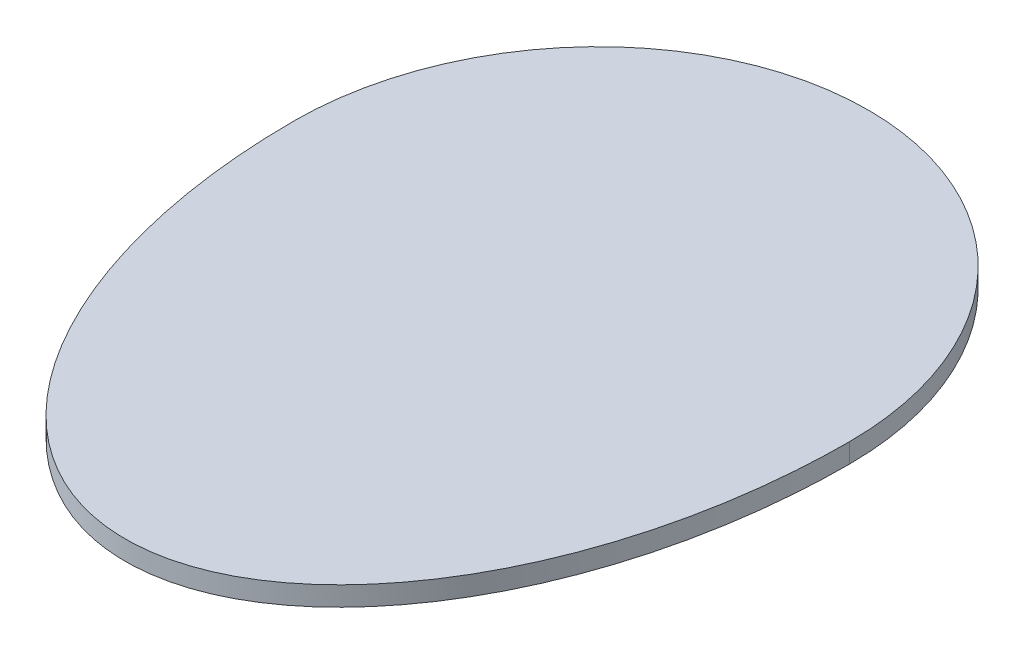
ISO-10303-21;
HEADER;
FILE_DESCRIPTION(('STEP AP214'),'2;1');
FILE_NAME('part.step','',(''),(''),'','','');
FILE_SCHEMA(('AUTOMOTIVE_DESIGN { 1 0 10303 214 1 1 1 1 }'));
ENDSEC;
DATA;
#1=APPLICATION_CONTEXT('core data for automotive mechanical design processes');
#2=APPLICATION_PROTOCOL_DEFINITION('international standard','automotive_design',2000,#1);
#3=PRODUCT_CONTEXT('',#1,'mechanical');
#4=PRODUCT('Part','Part','',(#3));
#5=PRODUCT_RELATED_PRODUCT_CATEGORY('part','',(#4));
#6=PRODUCT_DEFINITION_FORMATION('','',#4);
#7=PRODUCT_DEFINITION_CONTEXT('part definition',#1,'design');
#8=PRODUCT_DEFINITION('design','',#6,#7);
#9=PRODUCT_DEFINITION_SHAPE('','',#8);
#10=(LENGTH_UNIT() NAMED_UNIT(*) SI_UNIT(.MILLI.,.METRE.));
#11=(NAMED_UNIT(*) PLANE_ANGLE_UNIT() SI_UNIT($,.RADIAN.));
#12=(NAMED_UNIT(*) SI_UNIT($,.STERADIAN.) SOLID_ANGLE_UNIT());
#13=UNCERTAINTY_MEASURE_WITH_UNIT(LENGTH_MEASURE(1.E-05),#10,'distance_accuracy_value','');
#14=(GEOMETRIC_REPRESENTATION_CONTEXT(3) GLOBAL_UNCERTAINTY_ASSIGNED_CONTEXT((#13)) GLOBAL_UNIT_ASSIGNED_CONTEXT((#10,
#11,#12)) REPRESENTATION_CONTEXT('',''));
#15=CARTESIAN_POINT('',(0.,0.,0.));
#16=DIRECTION('',(0.,0.,1.));
#17=DIRECTION('',(1.,0.,0.));
#18=AXIS2_PLACEMENT_3D('',#15,#16,#17);
#19=CARTESIAN_POINT('',(0.,7.,0.));
#20=DIRECTION('',(0.,1.,0.));
#21=DIRECTION('',(0.,0.,1.));
#22=AXIS2_PLACEMENT_3D('',#19,#20,#21);
#23=ELLIPSE('',#22,160.73,100.);
#24=DIRECTION('',(0.,-1.,0.));
#25=VECTOR('',#24,1.);
#26=SURFACE_OF_LINEAR_EXTRUSION('',#23,#25);
#27=CARTESIAN_POINT('',(0.,0.,0.));
#28=DIRECTION('',(0.,1.,0.));
#29=DIRECTION('',(0.,0.,1.));
#30=AXIS2_PLACEMENT_3D('',#27,#28,#29);
#31=ELLIPSE('',#30,160.73,100.);
#32=CARTESIAN_POINT('',(-100.,0.,0.));
#33=VERTEX_POINT('',#32);
#34=CARTESIAN_POINT('',(100.,0.,0.));
#35=VERTEX_POINT('',#34);
#36=EDGE_CURVE('E66',#33,#35,#31,.T.);
#37=ORIENTED_EDGE('',*,*,#36,.T.);
#38=DIRECTION('',(0.,-1.,0.));
#39=VECTOR('',#38,1.);
#40=CARTESIAN_POINT('',(100.,7.,0.));
#41=LINE('',#40,#39);
#42=CARTESIAN_POINT('',(100.,7.,0.));
#43=VERTEX_POINT('',#42);
#44=EDGE_CURVE('E11',#43,#35,#41,.T.);
#45=ORIENTED_EDGE('',*,*,#44,.F.);
#46=CARTESIAN_POINT('',(-100.,7.,0.));
#47=VERTEX_POINT('',#46);
#48=EDGE_CURVE('E65',#47,#43,#23,.T.);
#49=ORIENTED_EDGE('',*,*,#48,.F.);
#50=DIRECTION('',(0.,-1.,0.));
#51=VECTOR('',#50,1.);
#52=CARTESIAN_POINT('',(-100.,7.,0.));
#53=LINE('',#52,#51);
#54=EDGE_CURVE('E43',#47,#33,#53,.T.);
#55=ORIENTED_EDGE('',*,*,#54,.T.);
#56=EDGE_LOOP('',(#37,#45,#49,#55));
#57=FACE_BOUND('',#56,.T.);
#58=ADVANCED_FACE('F34',(#57),#26,.F.);
#59=CARTESIAN_POINT('',(0.,7.,0.));
#60=DIRECTION('',(0.,1.,0.));
#61=DIRECTION('',(0.,0.,-1.));
#62=AXIS2_PLACEMENT_3D('',#59,#60,#61);
#63=ELLIPSE('',#62,106.76,100.);
#64=DIRECTION('',(0.,-1.,0.));
#65=VECTOR('',#64,1.);
#66=SURFACE_OF_LINEAR_EXTRUSION('',#63,#65);
#67=CARTESIAN_POINT('',(0.,0.,0.));
#68=DIRECTION('',(0.,1.,0.));
#69=DIRECTION('',(0.,0.,-1.));
#70=AXIS2_PLACEMENT_3D('',#67,#68,#69);
#71=ELLIPSE('',#70,106.76,100.);
#72=EDGE_CURVE('E58',#35,#33,#71,.T.);
#73=ORIENTED_EDGE('',*,*,#72,.T.);
#74=ORIENTED_EDGE('',*,*,#54,.F.);
#75=EDGE_CURVE('E50',#43,#47,#63,.T.);
#76=ORIENTED_EDGE('',*,*,#75,.F.);
#77=ORIENTED_EDGE('',*,*,#44,.T.);
#78=EDGE_LOOP('',(#73,#74,#76,#77));
#79=FACE_BOUND('',#78,.T.);
#80=ADVANCED_FACE('F61',(#79),#66,.F.);
#81=CARTESIAN_POINT('',(0.,7.,0.));
#82=DIRECTION('',(0.,-1.,0.));
#83=DIRECTION('',(0.,0.,-1.));
#84=AXIS2_PLACEMENT_3D('',#81,#82,#83);
#85=PLANE('',#84);
#86=ORIENTED_EDGE('',*,*,#48,.T.);
#87=ORIENTED_EDGE('',*,*,#75,.T.);
#88=EDGE_LOOP('',(#86,#87));
#89=FACE_BOUND('',#88,.T.);
#90=ADVANCED_FACE('F76',(#89),#85,.F.);
#91=CARTESIAN_POINT('',(0.,0.,0.));
#92=DIRECTION('',(0.,-1.,0.));
#93=DIRECTION('',(0.,0.,-1.));
#94=AXIS2_PLACEMENT_3D('',#91,#92,#93);
#95=PLANE('',#94);
#96=ORIENTED_EDGE('',*,*,#36,.F.);
#97=ORIENTED_EDGE('',*,*,#72,.F.);
#98=EDGE_LOOP('',(#96,#97));
#99=FACE_BOUND('',#98,.T.);
#100=ADVANCED_FACE('F69',(#99),#95,.T.);
#101=CLOSED_SHELL('',(#58,#80,#90,#100));
#102=MANIFOLD_SOLID_BREP('B2',#101);
#103=ADVANCED_BREP_SHAPE_REPRESENTATION('',(#18,#102),#14);
#104=SHAPE_DEFINITION_REPRESENTATION(#9,#103);
ENDSEC;
END-ISO-10303-21;
